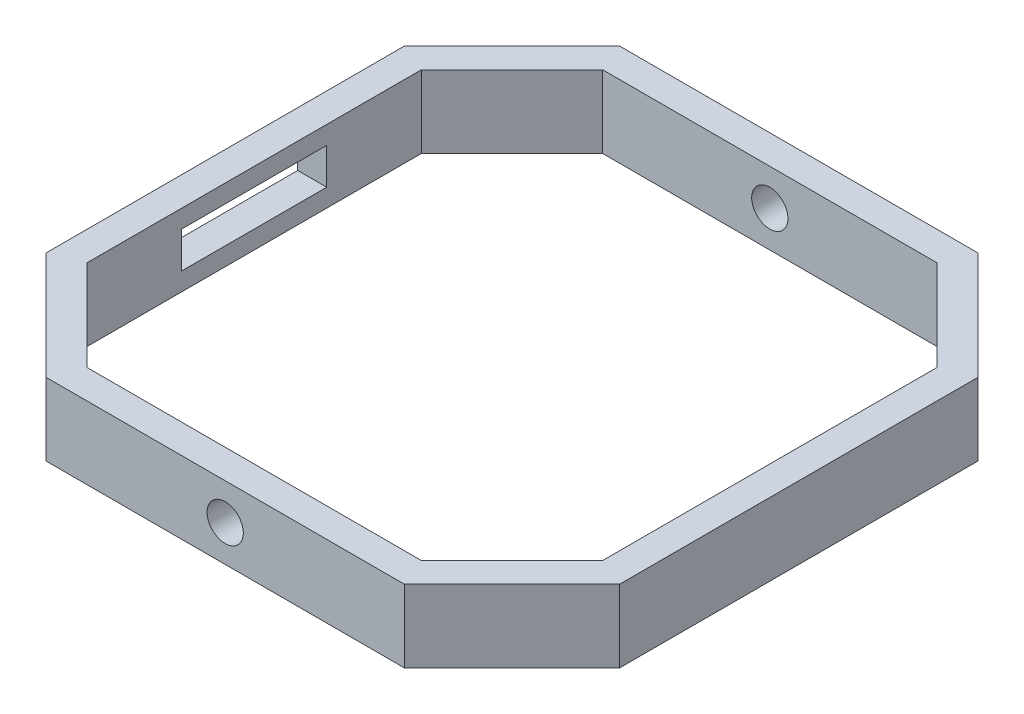
ISO-10303-21;
HEADER;
FILE_DESCRIPTION(('STEP AP214'),'2;1');
FILE_NAME('part.step','',(''),(''),'','','');
FILE_SCHEMA(('AUTOMOTIVE_DESIGN { 1 0 10303 214 1 1 1 1 }'));
ENDSEC;
DATA;
#1=APPLICATION_CONTEXT('core data for automotive mechanical design processes');
#2=APPLICATION_PROTOCOL_DEFINITION('international standard','automotive_design',2000,#1);
#3=PRODUCT_CONTEXT('',#1,'mechanical');
#4=PRODUCT('Part','Part','',(#3));
#5=PRODUCT_RELATED_PRODUCT_CATEGORY('part','',(#4));
#6=PRODUCT_DEFINITION_FORMATION('','',#4);
#7=PRODUCT_DEFINITION_CONTEXT('part definition',#1,'design');
#8=PRODUCT_DEFINITION('design','',#6,#7);
#9=PRODUCT_DEFINITION_SHAPE('','',#8);
#10=(LENGTH_UNIT() NAMED_UNIT(*) SI_UNIT(.MILLI.,.METRE.));
#11=(NAMED_UNIT(*) PLANE_ANGLE_UNIT() SI_UNIT($,.RADIAN.));
#12=(NAMED_UNIT(*) SI_UNIT($,.STERADIAN.) SOLID_ANGLE_UNIT());
#13=UNCERTAINTY_MEASURE_WITH_UNIT(LENGTH_MEASURE(1.E-05),#10,'distance_accuracy_value','');
#14=(GEOMETRIC_REPRESENTATION_CONTEXT(3) GLOBAL_UNCERTAINTY_ASSIGNED_CONTEXT((#13)) GLOBAL_UNIT_ASSIGNED_CONTEXT((#10,
#11,#12)) REPRESENTATION_CONTEXT('',''));
#15=CARTESIAN_POINT('',(0.,0.,0.));
#16=DIRECTION('',(0.,0.,1.));
#17=DIRECTION('',(1.,0.,0.));
#18=AXIS2_PLACEMENT_3D('',#15,#16,#17);
#19=CARTESIAN_POINT('',(0.,5.,0.));
#20=DIRECTION('',(0.,-1.,0.));
#21=DIRECTION('',(0.,0.,-1.));
#22=AXIS2_PLACEMENT_3D('',#19,#20,#21);
#23=PLANE('',#22);
#24=DIRECTION('',(-0.707106781186548,0.,0.707106781186548));
#25=VECTOR('',#24,1.);
#26=CARTESIAN_POINT('',(-39.55,5.,-24.7068542494924));
#27=LINE('',#26,#25);
#28=CARTESIAN_POINT('',(-24.7068542494924,5.,-39.55));
#29=VERTEX_POINT('',#28);
#30=CARTESIAN_POINT('',(-39.55,5.,-24.7068542494924));
#31=VERTEX_POINT('',#30);
#32=EDGE_CURVE('E277',#29,#31,#27,.T.);
#33=ORIENTED_EDGE('',*,*,#32,.T.);
#34=DIRECTION('',(0.,0.,1.));
#35=VECTOR('',#34,1.);
#36=CARTESIAN_POINT('',(-39.55,5.,24.7068542494924));
#37=LINE('',#36,#35);
#38=CARTESIAN_POINT('',(-39.55,5.,24.7068542494924));
#39=VERTEX_POINT('',#38);
#40=EDGE_CURVE('E280',#31,#39,#37,.T.);
#41=ORIENTED_EDGE('',*,*,#40,.T.);
#42=DIRECTION('',(0.707106781186548,0.,0.707106781186548));
#43=VECTOR('',#42,1.);
#44=CARTESIAN_POINT('',(-39.55,5.,24.7068542494924));
#45=LINE('',#44,#43);
#46=CARTESIAN_POINT('',(-24.7068542494924,5.,39.55));
#47=VERTEX_POINT('',#46);
#48=EDGE_CURVE('E283',#39,#47,#45,.T.);
#49=ORIENTED_EDGE('',*,*,#48,.T.);
#50=DIRECTION('',(1.,0.,0.));
#51=VECTOR('',#50,1.);
#52=CARTESIAN_POINT('',(-24.7068542494924,5.,39.55));
#53=LINE('',#52,#51);
#54=CARTESIAN_POINT('',(24.7068542494924,5.,39.55));
#55=VERTEX_POINT('',#54);
#56=EDGE_CURVE('E285',#47,#55,#53,.T.);
#57=ORIENTED_EDGE('',*,*,#56,.T.);
#58=DIRECTION('',(0.707106781186548,0.,-0.707106781186548));
#59=VECTOR('',#58,1.);
#60=CARTESIAN_POINT('',(24.7068542494924,5.,39.55));
#61=LINE('',#60,#59);
#62=CARTESIAN_POINT('',(39.55,5.,24.7068542494924));
#63=VERTEX_POINT('',#62);
#64=EDGE_CURVE('E287',#55,#63,#61,.T.);
#65=ORIENTED_EDGE('',*,*,#64,.T.);
#66=DIRECTION('',(0.,0.,-1.));
#67=VECTOR('',#66,1.);
#68=CARTESIAN_POINT('',(39.55,5.,24.7068542494924));
#69=LINE('',#68,#67);
#70=CARTESIAN_POINT('',(39.55,5.,-24.7068542494924));
#71=VERTEX_POINT('',#70);
#72=EDGE_CURVE('E289',#63,#71,#69,.T.);
#73=ORIENTED_EDGE('',*,*,#72,.T.);
#74=DIRECTION('',(-0.707106781186547,0.,-0.707106781186548));
#75=VECTOR('',#74,1.);
#76=CARTESIAN_POINT('',(24.7068542494924,5.,-39.55));
#77=LINE('',#76,#75);
#78=CARTESIAN_POINT('',(24.7068542494924,5.,-39.55));
#79=VERTEX_POINT('',#78);
#80=EDGE_CURVE('E291',#71,#79,#77,.T.);
#81=ORIENTED_EDGE('',*,*,#80,.T.);
#82=DIRECTION('',(-1.,0.,0.));
#83=VECTOR('',#82,1.);
#84=CARTESIAN_POINT('',(-24.7068542494924,5.,-39.55));
#85=LINE('',#84,#83);
#86=EDGE_CURVE('E293',#79,#29,#85,.T.);
#87=ORIENTED_EDGE('',*,*,#86,.T.);
#88=EDGE_LOOP('',(#33,#41,#49,#57,#65,#73,#81,#87));
#89=FACE_BOUND('',#88,.T.);
#90=DIRECTION('',(0.,0.,1.));
#91=VECTOR('',#90,1.);
#92=CARTESIAN_POINT('',(-35.55,5.,23.05));
#93=LINE('',#92,#91);
#94=CARTESIAN_POINT('',(-35.55,5.,-23.05));
#95=VERTEX_POINT('',#94);
#96=CARTESIAN_POINT('',(-35.55,5.,23.05));
#97=VERTEX_POINT('',#96);
#98=EDGE_CURVE('E218',#95,#97,#93,.T.);
#99=ORIENTED_EDGE('',*,*,#98,.F.);
#100=DIRECTION('',(-0.707106781186547,0.,0.707106781186547));
#101=VECTOR('',#100,1.);
#102=CARTESIAN_POINT('',(-35.55,5.,-23.05));
#103=LINE('',#102,#101);
#104=CARTESIAN_POINT('',(-23.05,5.,-35.55));
#105=VERTEX_POINT('',#104);
#106=EDGE_CURVE('E234',#105,#95,#103,.T.);
#107=ORIENTED_EDGE('',*,*,#106,.F.);
#108=DIRECTION('',(-1.,0.,0.));
#109=VECTOR('',#108,1.);
#110=CARTESIAN_POINT('',(-23.05,5.,-35.55));
#111=LINE('',#110,#109);
#112=CARTESIAN_POINT('',(23.05,5.,-35.55));
#113=VERTEX_POINT('',#112);
#114=EDGE_CURVE('E231',#113,#105,#111,.T.);
#115=ORIENTED_EDGE('',*,*,#114,.F.);
#116=DIRECTION('',(-0.707106781186547,0.,-0.707106781186547));
#117=VECTOR('',#116,1.);
#118=CARTESIAN_POINT('',(23.05,5.,-35.55));
#119=LINE('',#118,#117);
#120=CARTESIAN_POINT('',(35.55,5.,-23.05));
#121=VERTEX_POINT('',#120);
#122=EDGE_CURVE('E229',#121,#113,#119,.T.);
#123=ORIENTED_EDGE('',*,*,#122,.F.);
#124=DIRECTION('',(0.,0.,-1.));
#125=VECTOR('',#124,1.);
#126=CARTESIAN_POINT('',(35.55,5.,23.05));
#127=LINE('',#126,#125);
#128=CARTESIAN_POINT('',(35.55,5.,23.05));
#129=VERTEX_POINT('',#128);
#130=EDGE_CURVE('E227',#129,#121,#127,.T.);
#131=ORIENTED_EDGE('',*,*,#130,.F.);
#132=DIRECTION('',(0.707106781186548,0.,-0.707106781186547));
#133=VECTOR('',#132,1.);
#134=CARTESIAN_POINT('',(23.05,5.,35.55));
#135=LINE('',#134,#133);
#136=CARTESIAN_POINT('',(23.05,5.,35.55));
#137=VERTEX_POINT('',#136);
#138=EDGE_CURVE('E225',#137,#129,#135,.T.);
#139=ORIENTED_EDGE('',*,*,#138,.F.);
#140=DIRECTION('',(1.,0.,0.));
#141=VECTOR('',#140,1.);
#142=CARTESIAN_POINT('',(-23.05,5.,35.55));
#143=LINE('',#142,#141);
#144=CARTESIAN_POINT('',(-23.05,5.,35.55));
#145=VERTEX_POINT('',#144);
#146=EDGE_CURVE('E223',#145,#137,#143,.T.);
#147=ORIENTED_EDGE('',*,*,#146,.F.);
#148=DIRECTION('',(0.707106781186547,0.,0.707106781186547));
#149=VECTOR('',#148,1.);
#150=CARTESIAN_POINT('',(-35.55,5.,23.05));
#151=LINE('',#150,#149);
#152=EDGE_CURVE('E220',#97,#145,#151,.T.);
#153=ORIENTED_EDGE('',*,*,#152,.F.);
#154=EDGE_LOOP('',(#99,#107,#115,#123,#131,#139,#147,#153));
#155=FACE_BOUND('',#154,.T.);
#156=ADVANCED_FACE('F40',(#89,#155),#23,.F.);
#157=CARTESIAN_POINT('',(0.,-5.,0.));
#158=DIRECTION('',(0.,-1.,0.));
#159=DIRECTION('',(0.,0.,-1.));
#160=AXIS2_PLACEMENT_3D('',#157,#158,#159);
#161=PLANE('',#160);
#162=DIRECTION('',(-0.707106781186548,0.,0.707106781186548));
#163=VECTOR('',#162,1.);
#164=CARTESIAN_POINT('',(-39.55,-5.,-24.7068542494924));
#165=LINE('',#164,#163);
#166=CARTESIAN_POINT('',(-24.7068542494924,-5.,-39.55));
#167=VERTEX_POINT('',#166);
#168=CARTESIAN_POINT('',(-39.55,-5.,-24.7068542494924));
#169=VERTEX_POINT('',#168);
#170=EDGE_CURVE('E276',#167,#169,#165,.T.);
#171=ORIENTED_EDGE('',*,*,#170,.F.);
#172=DIRECTION('',(-1.,0.,0.));
#173=VECTOR('',#172,1.);
#174=CARTESIAN_POINT('',(-24.7068542494924,-5.,-39.55));
#175=LINE('',#174,#173);
#176=CARTESIAN_POINT('',(24.7068542494924,-5.,-39.55));
#177=VERTEX_POINT('',#176);
#178=EDGE_CURVE('E281',#177,#167,#175,.T.);
#179=ORIENTED_EDGE('',*,*,#178,.F.);
#180=DIRECTION('',(-0.707106781186547,0.,-0.707106781186548));
#181=VECTOR('',#180,1.);
#182=CARTESIAN_POINT('',(24.7068542494924,-5.,-39.55));
#183=LINE('',#182,#181);
#184=CARTESIAN_POINT('',(39.55,-5.,-24.7068542494924));
#185=VERTEX_POINT('',#184);
#186=EDGE_CURVE('E308',#185,#177,#183,.T.);
#187=ORIENTED_EDGE('',*,*,#186,.F.);
#188=DIRECTION('',(0.,0.,-1.));
#189=VECTOR('',#188,1.);
#190=CARTESIAN_POINT('',(39.55,-5.,24.7068542494924));
#191=LINE('',#190,#189);
#192=CARTESIAN_POINT('',(39.55,-5.,24.7068542494924));
#193=VERTEX_POINT('',#192);
#194=EDGE_CURVE('E306',#193,#185,#191,.T.);
#195=ORIENTED_EDGE('',*,*,#194,.F.);
#196=DIRECTION('',(0.707106781186548,0.,-0.707106781186548));
#197=VECTOR('',#196,1.);
#198=CARTESIAN_POINT('',(24.7068542494924,-5.,39.55));
#199=LINE('',#198,#197);
#200=CARTESIAN_POINT('',(24.7068542494924,-5.,39.55));
#201=VERTEX_POINT('',#200);
#202=EDGE_CURVE('E304',#201,#193,#199,.T.);
#203=ORIENTED_EDGE('',*,*,#202,.F.);
#204=DIRECTION('',(1.,0.,0.));
#205=VECTOR('',#204,1.);
#206=CARTESIAN_POINT('',(-24.7068542494924,-5.,39.55));
#207=LINE('',#206,#205);
#208=CARTESIAN_POINT('',(-24.7068542494924,-5.,39.55));
#209=VERTEX_POINT('',#208);
#210=EDGE_CURVE('E302',#209,#201,#207,.T.);
#211=ORIENTED_EDGE('',*,*,#210,.F.);
#212=DIRECTION('',(0.707106781186548,0.,0.707106781186548));
#213=VECTOR('',#212,1.);
#214=CARTESIAN_POINT('',(-39.55,-5.,24.7068542494924));
#215=LINE('',#214,#213);
#216=CARTESIAN_POINT('',(-39.55,-5.,24.7068542494924));
#217=VERTEX_POINT('',#216);
#218=EDGE_CURVE('E300',#217,#209,#215,.T.);
#219=ORIENTED_EDGE('',*,*,#218,.F.);
#220=DIRECTION('',(0.,0.,1.));
#221=VECTOR('',#220,1.);
#222=CARTESIAN_POINT('',(-39.55,-5.,24.7068542494924));
#223=LINE('',#222,#221);
#224=EDGE_CURVE('E298',#169,#217,#223,.T.);
#225=ORIENTED_EDGE('',*,*,#224,.F.);
#226=EDGE_LOOP('',(#171,#179,#187,#195,#203,#211,#219,#225));
#227=FACE_BOUND('',#226,.T.);
#228=DIRECTION('',(-0.707106781186547,0.,0.707106781186547));
#229=VECTOR('',#228,1.);
#230=CARTESIAN_POINT('',(-35.55,-5.,-23.05));
#231=LINE('',#230,#229);
#232=CARTESIAN_POINT('',(-23.05,-5.,-35.55));
#233=VERTEX_POINT('',#232);
#234=CARTESIAN_POINT('',(-35.55,-5.,-23.05));
#235=VERTEX_POINT('',#234);
#236=EDGE_CURVE('E221',#233,#235,#231,.T.);
#237=ORIENTED_EDGE('',*,*,#236,.T.);
#238=DIRECTION('',(0.,0.,1.));
#239=VECTOR('',#238,1.);
#240=CARTESIAN_POINT('',(-35.55,-5.,23.05));
#241=LINE('',#240,#239);
#242=CARTESIAN_POINT('',(-35.55,-5.,23.05));
#243=VERTEX_POINT('',#242);
#244=EDGE_CURVE('E214',#235,#243,#241,.T.);
#245=ORIENTED_EDGE('',*,*,#244,.T.);
#246=DIRECTION('',(0.707106781186547,0.,0.707106781186547));
#247=VECTOR('',#246,1.);
#248=CARTESIAN_POINT('',(-35.55,-5.,23.05));
#249=LINE('',#248,#247);
#250=CARTESIAN_POINT('',(-23.05,-5.,35.55));
#251=VERTEX_POINT('',#250);
#252=EDGE_CURVE('E239',#243,#251,#249,.T.);
#253=ORIENTED_EDGE('',*,*,#252,.T.);
#254=DIRECTION('',(1.,0.,0.));
#255=VECTOR('',#254,1.);
#256=CARTESIAN_POINT('',(-23.05,-5.,35.55));
#257=LINE('',#256,#255);
#258=CARTESIAN_POINT('',(23.05,-5.,35.55));
#259=VERTEX_POINT('',#258);
#260=EDGE_CURVE('E242',#251,#259,#257,.T.);
#261=ORIENTED_EDGE('',*,*,#260,.T.);
#262=DIRECTION('',(0.707106781186548,0.,-0.707106781186547));
#263=VECTOR('',#262,1.);
#264=CARTESIAN_POINT('',(23.05,-5.,35.55));
#265=LINE('',#264,#263);
#266=CARTESIAN_POINT('',(35.55,-5.,23.05));
#267=VERTEX_POINT('',#266);
#268=EDGE_CURVE('E245',#259,#267,#265,.T.);
#269=ORIENTED_EDGE('',*,*,#268,.T.);
#270=DIRECTION('',(0.,0.,-1.));
#271=VECTOR('',#270,1.);
#272=CARTESIAN_POINT('',(35.55,-5.,23.05));
#273=LINE('',#272,#271);
#274=CARTESIAN_POINT('',(35.55,-5.,-23.05));
#275=VERTEX_POINT('',#274);
#276=EDGE_CURVE('E248',#267,#275,#273,.T.);
#277=ORIENTED_EDGE('',*,*,#276,.T.);
#278=DIRECTION('',(-0.707106781186547,0.,-0.707106781186547));
#279=VECTOR('',#278,1.);
#280=CARTESIAN_POINT('',(23.05,-5.,-35.55));
#281=LINE('',#280,#279);
#282=CARTESIAN_POINT('',(23.05,-5.,-35.55));
#283=VERTEX_POINT('',#282);
#284=EDGE_CURVE('E251',#275,#283,#281,.T.);
#285=ORIENTED_EDGE('',*,*,#284,.T.);
#286=DIRECTION('',(-1.,0.,0.));
#287=VECTOR('',#286,1.);
#288=CARTESIAN_POINT('',(-23.05,-5.,-35.55));
#289=LINE('',#288,#287);
#290=EDGE_CURVE('E254',#283,#233,#289,.T.);
#291=ORIENTED_EDGE('',*,*,#290,.T.);
#292=EDGE_LOOP('',(#237,#245,#253,#261,#269,#277,#285,#291));
#293=FACE_BOUND('',#292,.T.);
#294=ADVANCED_FACE('F338',(#227,#293),#161,.T.);
#295=CARTESIAN_POINT('',(-39.55,5.,-24.7068542494924));
#296=DIRECTION('',(0.707106781186548,0.,0.707106781186548));
#297=DIRECTION('',(0.707106781186548,0.,-0.707106781186548));
#298=AXIS2_PLACEMENT_3D('',#295,#296,#297);
#299=PLANE('',#298);
#300=ORIENTED_EDGE('',*,*,#170,.T.);
#301=DIRECTION('',(0.,-1.,0.));
#302=VECTOR('',#301,1.);
#303=CARTESIAN_POINT('',(-39.55,5.,-24.7068542494924));
#304=LINE('',#303,#302);
#305=EDGE_CURVE('E11',#31,#169,#304,.T.);
#306=ORIENTED_EDGE('',*,*,#305,.F.);
#307=ORIENTED_EDGE('',*,*,#32,.F.);
#308=DIRECTION('',(0.,-1.,0.));
#309=VECTOR('',#308,1.);
#310=CARTESIAN_POINT('',(-24.7068542494924,5.,-39.55));
#311=LINE('',#310,#309);
#312=EDGE_CURVE('E295',#29,#167,#311,.T.);
#313=ORIENTED_EDGE('',*,*,#312,.T.);
#314=EDGE_LOOP('',(#300,#306,#307,#313));
#315=FACE_BOUND('',#314,.T.);
#316=ADVANCED_FACE('F42',(#315),#299,.F.);
#317=CARTESIAN_POINT('',(-39.55,5.,24.7068542494924));
#318=DIRECTION('',(1.,0.,0.));
#319=DIRECTION('',(0.,0.,-1.));
#320=AXIS2_PLACEMENT_3D('',#317,#318,#319);
#321=PLANE('',#320);
#322=DIRECTION('',(0.,-1.,0.));
#323=VECTOR('',#322,1.);
#324=CARTESIAN_POINT('',(-39.55,5.,10.));
#325=LINE('',#324,#323);
#326=CARTESIAN_POINT('',(-39.55,2.5,10.));
#327=VERTEX_POINT('',#326);
#328=CARTESIAN_POINT('',(-39.55,-2.5,10.));
#329=VERTEX_POINT('',#328);
#330=EDGE_CURVE('E186',#327,#329,#325,.T.);
#331=ORIENTED_EDGE('',*,*,#330,.T.);
#332=DIRECTION('',(0.,0.,-1.));
#333=VECTOR('',#332,1.);
#334=CARTESIAN_POINT('',(-39.55,-2.5,23.05));
#335=LINE('',#334,#333);
#336=CARTESIAN_POINT('',(-39.55,-2.5,-10.));
#337=VERTEX_POINT('',#336);
#338=EDGE_CURVE('E180',#329,#337,#335,.T.);
#339=ORIENTED_EDGE('',*,*,#338,.T.);
#340=DIRECTION('',(0.,1.,0.));
#341=VECTOR('',#340,1.);
#342=CARTESIAN_POINT('',(-39.55,5.,-10.));
#343=LINE('',#342,#341);
#344=CARTESIAN_POINT('',(-39.55,2.5,-10.));
#345=VERTEX_POINT('',#344);
#346=EDGE_CURVE('E189',#337,#345,#343,.T.);
#347=ORIENTED_EDGE('',*,*,#346,.T.);
#348=DIRECTION('',(0.,0.,1.));
#349=VECTOR('',#348,1.);
#350=CARTESIAN_POINT('',(-39.55,2.5,23.05));
#351=LINE('',#350,#349);
#352=EDGE_CURVE('E56',#345,#327,#351,.T.);
#353=ORIENTED_EDGE('',*,*,#352,.T.);
#354=EDGE_LOOP('',(#331,#339,#347,#353));
#355=FACE_BOUND('',#354,.T.);
#356=ORIENTED_EDGE('',*,*,#224,.T.);
#357=DIRECTION('',(0.,-1.,0.));
#358=VECTOR('',#357,1.);
#359=CARTESIAN_POINT('',(-39.55,5.,24.7068542494924));
#360=LINE('',#359,#358);
#361=EDGE_CURVE('E49',#39,#217,#360,.T.);
#362=ORIENTED_EDGE('',*,*,#361,.F.);
#363=ORIENTED_EDGE('',*,*,#40,.F.);
#364=ORIENTED_EDGE('',*,*,#305,.T.);
#365=EDGE_LOOP('',(#356,#362,#363,#364));
#366=FACE_BOUND('',#365,.T.);
#367=ADVANCED_FACE('F193',(#355,#366),#321,.F.);
#368=CARTESIAN_POINT('',(-39.55,5.,24.7068542494924));
#369=DIRECTION('',(0.707106781186548,0.,-0.707106781186548));
#370=DIRECTION('',(-0.707106781186548,0.,-0.707106781186548));
#371=AXIS2_PLACEMENT_3D('',#368,#369,#370);
#372=PLANE('',#371);
#373=ORIENTED_EDGE('',*,*,#218,.T.);
#374=DIRECTION('',(0.,-1.,0.));
#375=VECTOR('',#374,1.);
#376=CARTESIAN_POINT('',(-24.7068542494924,5.,39.55));
#377=LINE('',#376,#375);
#378=EDGE_CURVE('E325',#47,#209,#377,.T.);
#379=ORIENTED_EDGE('',*,*,#378,.F.);
#380=ORIENTED_EDGE('',*,*,#48,.F.);
#381=ORIENTED_EDGE('',*,*,#361,.T.);
#382=EDGE_LOOP('',(#373,#379,#380,#381));
#383=FACE_BOUND('',#382,.T.);
#384=ADVANCED_FACE('F333',(#383),#372,.F.);
#385=CARTESIAN_POINT('',(-24.7068542494924,5.,39.55));
#386=DIRECTION('',(0.,0.,-1.));
#387=DIRECTION('',(-1.,0.,0.));
#388=AXIS2_PLACEMENT_3D('',#385,#386,#387);
#389=PLANE('',#388);
#390=CARTESIAN_POINT('',(0.,0.,39.55));
#391=DIRECTION('',(0.,0.,-1.));
#392=DIRECTION('',(-1.,0.,0.));
#393=AXIS2_PLACEMENT_3D('',#390,#391,#392);
#394=CIRCLE('',#393,2.5);
#395=CARTESIAN_POINT('',(-2.5,0.,39.55));
#396=VERTEX_POINT('',#395);
#397=EDGE_CURVE('E404',#396,#396,#394,.T.);
#398=ORIENTED_EDGE('',*,*,#397,.T.);
#399=EDGE_LOOP('',(#398));
#400=FACE_BOUND('',#399,.T.);
#401=ORIENTED_EDGE('',*,*,#210,.T.);
#402=DIRECTION('',(0.,-1.,0.));
#403=VECTOR('',#402,1.);
#404=CARTESIAN_POINT('',(24.7068542494924,5.,39.55));
#405=LINE('',#404,#403);
#406=EDGE_CURVE('E322',#55,#201,#405,.T.);
#407=ORIENTED_EDGE('',*,*,#406,.F.);
#408=ORIENTED_EDGE('',*,*,#56,.F.);
#409=ORIENTED_EDGE('',*,*,#378,.T.);
#410=EDGE_LOOP('',(#401,#407,#408,#409));
#411=FACE_BOUND('',#410,.T.);
#412=ADVANCED_FACE('F344',(#400,#411),#389,.F.);
#413=CARTESIAN_POINT('',(24.7068542494924,5.,39.55));
#414=DIRECTION('',(-0.707106781186548,0.,-0.707106781186548));
#415=DIRECTION('',(-0.707106781186548,0.,0.707106781186548));
#416=AXIS2_PLACEMENT_3D('',#413,#414,#415);
#417=PLANE('',#416);
#418=ORIENTED_EDGE('',*,*,#202,.T.);
#419=DIRECTION('',(0.,-1.,0.));
#420=VECTOR('',#419,1.);
#421=CARTESIAN_POINT('',(39.55,5.,24.7068542494924));
#422=LINE('',#421,#420);
#423=EDGE_CURVE('E319',#63,#193,#422,.T.);
#424=ORIENTED_EDGE('',*,*,#423,.F.);
#425=ORIENTED_EDGE('',*,*,#64,.F.);
#426=ORIENTED_EDGE('',*,*,#406,.T.);
#427=EDGE_LOOP('',(#418,#424,#425,#426));
#428=FACE_BOUND('',#427,.T.);
#429=ADVANCED_FACE('F348',(#428),#417,.F.);
#430=CARTESIAN_POINT('',(39.55,5.,24.7068542494924));
#431=DIRECTION('',(-1.,0.,0.));
#432=DIRECTION('',(0.,0.,1.));
#433=AXIS2_PLACEMENT_3D('',#430,#431,#432);
#434=PLANE('',#433);
#435=ORIENTED_EDGE('',*,*,#194,.T.);
#436=DIRECTION('',(0.,-1.,0.));
#437=VECTOR('',#436,1.);
#438=CARTESIAN_POINT('',(39.55,5.,-24.7068542494924));
#439=LINE('',#438,#437);
#440=EDGE_CURVE('E316',#71,#185,#439,.T.);
#441=ORIENTED_EDGE('',*,*,#440,.F.);
#442=ORIENTED_EDGE('',*,*,#72,.F.);
#443=ORIENTED_EDGE('',*,*,#423,.T.);
#444=EDGE_LOOP('',(#435,#441,#442,#443));
#445=FACE_BOUND('',#444,.T.);
#446=ADVANCED_FACE('F368',(#445),#434,.F.);
#447=CARTESIAN_POINT('',(24.7068542494924,5.,-39.55));
#448=DIRECTION('',(-0.707106781186548,0.,0.707106781186547));
#449=DIRECTION('',(0.707106781186547,0.,0.707106781186548));
#450=AXIS2_PLACEMENT_3D('',#447,#448,#449);
#451=PLANE('',#450);
#452=ORIENTED_EDGE('',*,*,#186,.T.);
#453=DIRECTION('',(0.,-1.,0.));
#454=VECTOR('',#453,1.);
#455=CARTESIAN_POINT('',(24.7068542494924,5.,-39.55));
#456=LINE('',#455,#454);
#457=EDGE_CURVE('E313',#79,#177,#456,.T.);
#458=ORIENTED_EDGE('',*,*,#457,.F.);
#459=ORIENTED_EDGE('',*,*,#80,.F.);
#460=ORIENTED_EDGE('',*,*,#440,.T.);
#461=EDGE_LOOP('',(#452,#458,#459,#460));
#462=FACE_BOUND('',#461,.T.);
#463=ADVANCED_FACE('F366',(#462),#451,.F.);
#464=CARTESIAN_POINT('',(-24.7068542494924,5.,-39.55));
#465=DIRECTION('',(0.,0.,1.));
#466=DIRECTION('',(1.,0.,0.));
#467=AXIS2_PLACEMENT_3D('',#464,#465,#466);
#468=PLANE('',#467);
#469=CARTESIAN_POINT('',(0.,0.,-39.55));
#470=DIRECTION('',(0.,0.,1.));
#471=DIRECTION('',(1.,0.,0.));
#472=AXIS2_PLACEMENT_3D('',#469,#470,#471);
#473=CIRCLE('',#472,2.5);
#474=CARTESIAN_POINT('',(2.5,0.,-39.55));
#475=VERTEX_POINT('',#474);
#476=EDGE_CURVE('E202',#475,#475,#473,.T.);
#477=ORIENTED_EDGE('',*,*,#476,.T.);
#478=EDGE_LOOP('',(#477));
#479=FACE_BOUND('',#478,.T.);
#480=ORIENTED_EDGE('',*,*,#178,.T.);
#481=ORIENTED_EDGE('',*,*,#312,.F.);
#482=ORIENTED_EDGE('',*,*,#86,.F.);
#483=ORIENTED_EDGE('',*,*,#457,.T.);
#484=EDGE_LOOP('',(#480,#481,#482,#483));
#485=FACE_BOUND('',#484,.T.);
#486=ADVANCED_FACE('F361',(#479,#485),#468,.F.);
#487=CARTESIAN_POINT('',(-35.55,5.,23.05));
#488=DIRECTION('',(1.,0.,0.));
#489=DIRECTION('',(0.,0.,-1.));
#490=AXIS2_PLACEMENT_3D('',#487,#488,#489);
#491=PLANE('',#490);
#492=DIRECTION('',(0.,0.,-1.));
#493=VECTOR('',#492,1.);
#494=CARTESIAN_POINT('',(-35.55,-2.5,23.05));
#495=LINE('',#494,#493);
#496=CARTESIAN_POINT('',(-35.55,-2.5,10.));
#497=VERTEX_POINT('',#496);
#498=CARTESIAN_POINT('',(-35.55,-2.5,-10.));
#499=VERTEX_POINT('',#498);
#500=EDGE_CURVE('E64',#497,#499,#495,.T.);
#501=ORIENTED_EDGE('',*,*,#500,.F.);
#502=DIRECTION('',(0.,-1.,0.));
#503=VECTOR('',#502,1.);
#504=CARTESIAN_POINT('',(-35.55,5.,10.));
#505=LINE('',#504,#503);
#506=CARTESIAN_POINT('',(-35.55,2.5,10.));
#507=VERTEX_POINT('',#506);
#508=EDGE_CURVE('E196',#507,#497,#505,.T.);
#509=ORIENTED_EDGE('',*,*,#508,.F.);
#510=DIRECTION('',(0.,0.,1.));
#511=VECTOR('',#510,1.);
#512=CARTESIAN_POINT('',(-35.55,2.5,23.05));
#513=LINE('',#512,#511);
#514=CARTESIAN_POINT('',(-35.55,2.5,-10.));
#515=VERTEX_POINT('',#514);
#516=EDGE_CURVE('E199',#515,#507,#513,.T.);
#517=ORIENTED_EDGE('',*,*,#516,.F.);
#518=DIRECTION('',(0.,1.,0.));
#519=VECTOR('',#518,1.);
#520=CARTESIAN_POINT('',(-35.55,5.,-10.));
#521=LINE('',#520,#519);
#522=EDGE_CURVE('E208',#499,#515,#521,.T.);
#523=ORIENTED_EDGE('',*,*,#522,.F.);
#524=EDGE_LOOP('',(#501,#509,#517,#523));
#525=FACE_BOUND('',#524,.T.);
#526=ORIENTED_EDGE('',*,*,#244,.F.);
#527=DIRECTION('',(0.,-1.,0.));
#528=VECTOR('',#527,1.);
#529=CARTESIAN_POINT('',(-35.55,5.,-23.05));
#530=LINE('',#529,#528);
#531=EDGE_CURVE('E236',#95,#235,#530,.T.);
#532=ORIENTED_EDGE('',*,*,#531,.F.);
#533=ORIENTED_EDGE('',*,*,#98,.T.);
#534=DIRECTION('',(0.,-1.,0.));
#535=VECTOR('',#534,1.);
#536=CARTESIAN_POINT('',(-35.55,5.,23.05));
#537=LINE('',#536,#535);
#538=EDGE_CURVE('E273',#97,#243,#537,.T.);
#539=ORIENTED_EDGE('',*,*,#538,.T.);
#540=EDGE_LOOP('',(#526,#532,#533,#539));
#541=FACE_BOUND('',#540,.T.);
#542=ADVANCED_FACE('F384',(#525,#541),#491,.T.);
#543=CARTESIAN_POINT('',(-35.55,5.,23.05));
#544=DIRECTION('',(0.707106781186548,0.,-0.707106781186548));
#545=DIRECTION('',(-0.707106781186548,0.,-0.707106781186548));
#546=AXIS2_PLACEMENT_3D('',#543,#544,#545);
#547=PLANE('',#546);
#548=ORIENTED_EDGE('',*,*,#252,.F.);
#549=ORIENTED_EDGE('',*,*,#538,.F.);
#550=ORIENTED_EDGE('',*,*,#152,.T.);
#551=DIRECTION('',(0.,-1.,0.));
#552=VECTOR('',#551,1.);
#553=CARTESIAN_POINT('',(-23.05,5.,35.55));
#554=LINE('',#553,#552);
#555=EDGE_CURVE('E271',#145,#251,#554,.T.);
#556=ORIENTED_EDGE('',*,*,#555,.T.);
#557=EDGE_LOOP('',(#548,#549,#550,#556));
#558=FACE_BOUND('',#557,.T.);
#559=ADVANCED_FACE('F394',(#558),#547,.T.);
#560=CARTESIAN_POINT('',(-23.05,5.,35.55));
#561=DIRECTION('',(0.,0.,-1.));
#562=DIRECTION('',(-1.,0.,0.));
#563=AXIS2_PLACEMENT_3D('',#560,#561,#562);
#564=PLANE('',#563);
#565=CARTESIAN_POINT('',(0.,0.,35.55));
#566=DIRECTION('',(0.,0.,-1.));
#567=DIRECTION('',(-1.,0.,0.));
#568=AXIS2_PLACEMENT_3D('',#565,#566,#567);
#569=CIRCLE('',#568,2.5);
#570=CARTESIAN_POINT('',(-2.5,0.,35.55));
#571=VERTEX_POINT('',#570);
#572=EDGE_CURVE('E399',#571,#571,#569,.T.);
#573=ORIENTED_EDGE('',*,*,#572,.F.);
#574=EDGE_LOOP('',(#573));
#575=FACE_BOUND('',#574,.T.);
#576=ORIENTED_EDGE('',*,*,#260,.F.);
#577=ORIENTED_EDGE('',*,*,#555,.F.);
#578=ORIENTED_EDGE('',*,*,#146,.T.);
#579=DIRECTION('',(0.,-1.,0.));
#580=VECTOR('',#579,1.);
#581=CARTESIAN_POINT('',(23.05,5.,35.55));
#582=LINE('',#581,#580);
#583=EDGE_CURVE('E269',#137,#259,#582,.T.);
#584=ORIENTED_EDGE('',*,*,#583,.T.);
#585=EDGE_LOOP('',(#576,#577,#578,#584));
#586=FACE_BOUND('',#585,.T.);
#587=ADVANCED_FACE('F449',(#575,#586),#564,.T.);
#588=CARTESIAN_POINT('',(23.05,5.,35.55));
#589=DIRECTION('',(-0.707106781186547,0.,-0.707106781186548));
#590=DIRECTION('',(-0.707106781186548,0.,0.707106781186547));
#591=AXIS2_PLACEMENT_3D('',#588,#589,#590);
#592=PLANE('',#591);
#593=ORIENTED_EDGE('',*,*,#268,.F.);
#594=ORIENTED_EDGE('',*,*,#583,.F.);
#595=ORIENTED_EDGE('',*,*,#138,.T.);
#596=DIRECTION('',(0.,-1.,0.));
#597=VECTOR('',#596,1.);
#598=CARTESIAN_POINT('',(35.55,5.,23.05));
#599=LINE('',#598,#597);
#600=EDGE_CURVE('E267',#129,#267,#599,.T.);
#601=ORIENTED_EDGE('',*,*,#600,.T.);
#602=EDGE_LOOP('',(#593,#594,#595,#601));
#603=FACE_BOUND('',#602,.T.);
#604=ADVANCED_FACE('F445',(#603),#592,.T.);
#605=CARTESIAN_POINT('',(35.55,5.,23.05));
#606=DIRECTION('',(-1.,0.,0.));
#607=DIRECTION('',(0.,0.,1.));
#608=AXIS2_PLACEMENT_3D('',#605,#606,#607);
#609=PLANE('',#608);
#610=ORIENTED_EDGE('',*,*,#276,.F.);
#611=ORIENTED_EDGE('',*,*,#600,.F.);
#612=ORIENTED_EDGE('',*,*,#130,.T.);
#613=DIRECTION('',(0.,-1.,0.));
#614=VECTOR('',#613,1.);
#615=CARTESIAN_POINT('',(35.55,5.,-23.05));
#616=LINE('',#615,#614);
#617=EDGE_CURVE('E265',#121,#275,#616,.T.);
#618=ORIENTED_EDGE('',*,*,#617,.T.);
#619=EDGE_LOOP('',(#610,#611,#612,#618));
#620=FACE_BOUND('',#619,.T.);
#621=ADVANCED_FACE('F441',(#620),#609,.T.);
#622=CARTESIAN_POINT('',(23.05,5.,-35.55));
#623=DIRECTION('',(-0.707106781186548,0.,0.707106781186548));
#624=DIRECTION('',(0.707106781186548,0.,0.707106781186548));
#625=AXIS2_PLACEMENT_3D('',#622,#623,#624);
#626=PLANE('',#625);
#627=ORIENTED_EDGE('',*,*,#284,.F.);
#628=ORIENTED_EDGE('',*,*,#617,.F.);
#629=ORIENTED_EDGE('',*,*,#122,.T.);
#630=DIRECTION('',(0.,-1.,0.));
#631=VECTOR('',#630,1.);
#632=CARTESIAN_POINT('',(23.05,5.,-35.55));
#633=LINE('',#632,#631);
#634=EDGE_CURVE('E263',#113,#283,#633,.T.);
#635=ORIENTED_EDGE('',*,*,#634,.T.);
#636=EDGE_LOOP('',(#627,#628,#629,#635));
#637=FACE_BOUND('',#636,.T.);
#638=ADVANCED_FACE('F437',(#637),#626,.T.);
#639=CARTESIAN_POINT('',(-23.05,5.,-35.55));
#640=DIRECTION('',(0.,0.,1.));
#641=DIRECTION('',(1.,0.,0.));
#642=AXIS2_PLACEMENT_3D('',#639,#640,#641);
#643=PLANE('',#642);
#644=CARTESIAN_POINT('',(0.,0.,-35.55));
#645=DIRECTION('',(0.,0.,1.));
#646=DIRECTION('',(1.,0.,0.));
#647=AXIS2_PLACEMENT_3D('',#644,#645,#646);
#648=CIRCLE('',#647,2.5);
#649=CARTESIAN_POINT('',(2.5,0.,-35.55));
#650=VERTEX_POINT('',#649);
#651=EDGE_CURVE('E44',#650,#650,#648,.T.);
#652=ORIENTED_EDGE('',*,*,#651,.F.);
#653=EDGE_LOOP('',(#652));
#654=FACE_BOUND('',#653,.T.);
#655=ORIENTED_EDGE('',*,*,#290,.F.);
#656=ORIENTED_EDGE('',*,*,#634,.F.);
#657=ORIENTED_EDGE('',*,*,#114,.T.);
#658=DIRECTION('',(0.,-1.,0.));
#659=VECTOR('',#658,1.);
#660=CARTESIAN_POINT('',(-23.05,5.,-35.55));
#661=LINE('',#660,#659);
#662=EDGE_CURVE('E261',#105,#233,#661,.T.);
#663=ORIENTED_EDGE('',*,*,#662,.T.);
#664=EDGE_LOOP('',(#655,#656,#657,#663));
#665=FACE_BOUND('',#664,.T.);
#666=ADVANCED_FACE('F433',(#654,#665),#643,.T.);
#667=CARTESIAN_POINT('',(-35.55,5.,-23.05));
#668=DIRECTION('',(0.707106781186548,0.,0.707106781186548));
#669=DIRECTION('',(0.707106781186548,0.,-0.707106781186548));
#670=AXIS2_PLACEMENT_3D('',#667,#668,#669);
#671=PLANE('',#670);
#672=ORIENTED_EDGE('',*,*,#236,.F.);
#673=ORIENTED_EDGE('',*,*,#662,.F.);
#674=ORIENTED_EDGE('',*,*,#106,.T.);
#675=ORIENTED_EDGE('',*,*,#531,.T.);
#676=EDGE_LOOP('',(#672,#673,#674,#675));
#677=FACE_BOUND('',#676,.T.);
#678=ADVANCED_FACE('F430',(#677),#671,.T.);
#679=CARTESIAN_POINT('',(-39.55,-2.5,23.05));
#680=DIRECTION('',(0.,-1.,0.));
#681=DIRECTION('',(0.,0.,-1.));
#682=AXIS2_PLACEMENT_3D('',#679,#680,#681);
#683=PLANE('',#682);
#684=ORIENTED_EDGE('',*,*,#500,.T.);
#685=DIRECTION('',(1.,0.,0.));
#686=VECTOR('',#685,1.);
#687=CARTESIAN_POINT('',(-39.55,-2.5,-10.));
#688=LINE('',#687,#686);
#689=EDGE_CURVE('E176',#337,#499,#688,.T.);
#690=ORIENTED_EDGE('',*,*,#689,.F.);
#691=ORIENTED_EDGE('',*,*,#338,.F.);
#692=DIRECTION('',(1.,0.,0.));
#693=VECTOR('',#692,1.);
#694=CARTESIAN_POINT('',(-39.55,-2.5,10.));
#695=LINE('',#694,#693);
#696=EDGE_CURVE('E212',#329,#497,#695,.T.);
#697=ORIENTED_EDGE('',*,*,#696,.T.);
#698=EDGE_LOOP('',(#684,#690,#691,#697));
#699=FACE_BOUND('',#698,.T.);
#700=ADVANCED_FACE('F178',(#699),#683,.F.);
#701=CARTESIAN_POINT('',(-39.55,5.,10.));
#702=DIRECTION('',(0.,0.,1.));
#703=DIRECTION('',(1.,0.,0.));
#704=AXIS2_PLACEMENT_3D('',#701,#702,#703);
#705=PLANE('',#704);
#706=ORIENTED_EDGE('',*,*,#508,.T.);
#707=ORIENTED_EDGE('',*,*,#696,.F.);
#708=ORIENTED_EDGE('',*,*,#330,.F.);
#709=DIRECTION('',(1.,0.,0.));
#710=VECTOR('',#709,1.);
#711=CARTESIAN_POINT('',(-39.55,2.5,10.));
#712=LINE('',#711,#710);
#713=EDGE_CURVE('E215',#327,#507,#712,.T.);
#714=ORIENTED_EDGE('',*,*,#713,.T.);
#715=EDGE_LOOP('',(#706,#707,#708,#714));
#716=FACE_BOUND('',#715,.T.);
#717=ADVANCED_FACE('F419',(#716),#705,.F.);
#718=CARTESIAN_POINT('',(-39.55,2.5,23.05));
#719=DIRECTION('',(0.,1.,0.));
#720=DIRECTION('',(0.,0.,1.));
#721=AXIS2_PLACEMENT_3D('',#718,#719,#720);
#722=PLANE('',#721);
#723=ORIENTED_EDGE('',*,*,#516,.T.);
#724=ORIENTED_EDGE('',*,*,#713,.F.);
#725=ORIENTED_EDGE('',*,*,#352,.F.);
#726=DIRECTION('',(1.,0.,0.));
#727=VECTOR('',#726,1.);
#728=CARTESIAN_POINT('',(-39.55,2.5,-10.));
#729=LINE('',#728,#727);
#730=EDGE_CURVE('E185',#345,#515,#729,.T.);
#731=ORIENTED_EDGE('',*,*,#730,.T.);
#732=EDGE_LOOP('',(#723,#724,#725,#731));
#733=FACE_BOUND('',#732,.T.);
#734=ADVANCED_FACE('F422',(#733),#722,.F.);
#735=CARTESIAN_POINT('',(-39.55,5.,-10.));
#736=DIRECTION('',(0.,0.,-1.));
#737=DIRECTION('',(-1.,0.,0.));
#738=AXIS2_PLACEMENT_3D('',#735,#736,#737);
#739=PLANE('',#738);
#740=ORIENTED_EDGE('',*,*,#522,.T.);
#741=ORIENTED_EDGE('',*,*,#730,.F.);
#742=ORIENTED_EDGE('',*,*,#346,.F.);
#743=ORIENTED_EDGE('',*,*,#689,.T.);
#744=EDGE_LOOP('',(#740,#741,#742,#743));
#745=FACE_BOUND('',#744,.T.);
#746=ADVANCED_FACE('F190',(#745),#739,.F.);
#747=CARTESIAN_POINT('',(0.,0.,39.55));
#748=DIRECTION('',(0.,0.,-1.));
#749=DIRECTION('',(-1.,0.,0.));
#750=AXIS2_PLACEMENT_3D('',#747,#748,#749);
#751=CYLINDRICAL_SURFACE('',#750,2.5);
#752=ORIENTED_EDGE('',*,*,#651,.T.);
#753=EDGE_LOOP('',(#752));
#754=FACE_BOUND('',#753,.T.);
#755=ORIENTED_EDGE('',*,*,#476,.F.);
#756=EDGE_LOOP('',(#755));
#757=FACE_BOUND('',#756,.T.);
#758=ADVANCED_FACE('F412',(#754,#757),#751,.F.);
#759=ORIENTED_EDGE('',*,*,#572,.T.);
#760=EDGE_LOOP('',(#759));
#761=FACE_BOUND('',#760,.T.);
#762=ORIENTED_EDGE('',*,*,#397,.F.);
#763=EDGE_LOOP('',(#762));
#764=FACE_BOUND('',#763,.T.);
#765=ADVANCED_FACE('F410',(#761,#764),#751,.F.);
#766=CLOSED_SHELL('',(#156,#294,#316,#367,#384,#412,#429,#446,#463,#486,#542,#559,#587,#604,
#621,#638,#666,#678,#700,#717,#734,#746,#758,#765));
#767=MANIFOLD_SOLID_BREP('B2',#766);
#768=ADVANCED_BREP_SHAPE_REPRESENTATION('',(#18,#767),#14);
#769=SHAPE_DEFINITION_REPRESENTATION(#9,#768);
ENDSEC;
END-ISO-10303-21;
